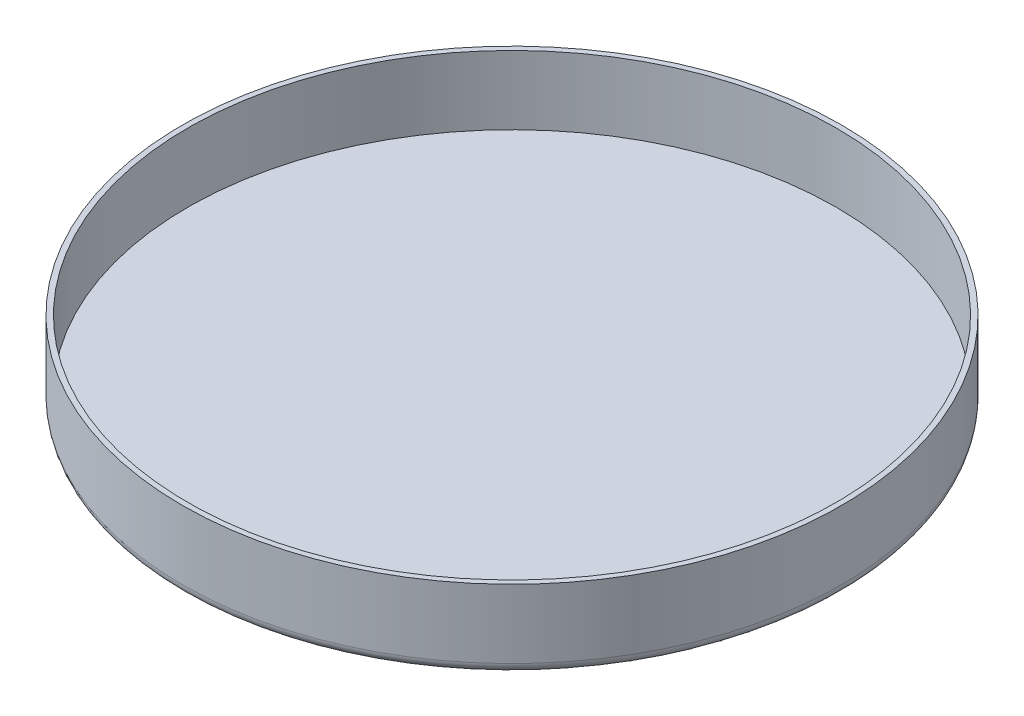
ISO-10303-21;
HEADER;
FILE_DESCRIPTION(('STEP AP214'),'2;1');
FILE_NAME('part.step','',(''),(''),'','','');
FILE_SCHEMA(('AUTOMOTIVE_DESIGN { 1 0 10303 214 1 1 1 1 }'));
ENDSEC;
DATA;
#1=APPLICATION_CONTEXT('core data for automotive mechanical design processes');
#2=APPLICATION_PROTOCOL_DEFINITION('international standard','automotive_design',2000,#1);
#3=PRODUCT_CONTEXT('',#1,'mechanical');
#4=PRODUCT('Part','Part','',(#3));
#5=PRODUCT_RELATED_PRODUCT_CATEGORY('part','',(#4));
#6=PRODUCT_DEFINITION_FORMATION('','',#4);
#7=PRODUCT_DEFINITION_CONTEXT('part definition',#1,'design');
#8=PRODUCT_DEFINITION('design','',#6,#7);
#9=PRODUCT_DEFINITION_SHAPE('','',#8);
#10=(LENGTH_UNIT() NAMED_UNIT(*) SI_UNIT(.MILLI.,.METRE.));
#11=(NAMED_UNIT(*) PLANE_ANGLE_UNIT() SI_UNIT($,.RADIAN.));
#12=(NAMED_UNIT(*) SI_UNIT($,.STERADIAN.) SOLID_ANGLE_UNIT());
#13=UNCERTAINTY_MEASURE_WITH_UNIT(LENGTH_MEASURE(1.E-05),#10,'distance_accuracy_value','');
#14=(GEOMETRIC_REPRESENTATION_CONTEXT(3) GLOBAL_UNCERTAINTY_ASSIGNED_CONTEXT((#13)) GLOBAL_UNIT_ASSIGNED_CONTEXT((#10,
#11,#12)) REPRESENTATION_CONTEXT('',''));
#15=CARTESIAN_POINT('',(0.,0.,0.));
#16=DIRECTION('',(0.,0.,1.));
#17=DIRECTION('',(1.,0.,0.));
#18=AXIS2_PLACEMENT_3D('',#15,#16,#17);
#19=CARTESIAN_POINT('',(0.,19.05,0.));
#20=DIRECTION('',(0.,1.,0.));
#21=DIRECTION('',(0.,0.,1.));
#22=AXIS2_PLACEMENT_3D('',#19,#20,#21);
#23=PLANE('',#22);
#24=CARTESIAN_POINT('',(0.,19.05,0.));
#25=DIRECTION('',(0.,1.,0.));
#26=DIRECTION('',(0.,0.,1.));
#27=AXIS2_PLACEMENT_3D('',#24,#25,#26);
#28=CIRCLE('',#27,79.248);
#29=CARTESIAN_POINT('',(0.,19.05,-79.248));
#30=VERTEX_POINT('',#29);
#31=EDGE_CURVE('E46',#30,#30,#28,.T.);
#32=ORIENTED_EDGE('',*,*,#31,.T.);
#33=EDGE_LOOP('',(#32));
#34=FACE_BOUND('',#33,.T.);
#35=CARTESIAN_POINT('',(0.,19.05,0.));
#36=DIRECTION('',(0.,1.,0.));
#37=DIRECTION('',(0.,0.,1.));
#38=AXIS2_PLACEMENT_3D('',#35,#36,#37);
#39=CIRCLE('',#38,77.978);
#40=CARTESIAN_POINT('',(0.,19.05,-77.978));
#41=VERTEX_POINT('',#40);
#42=EDGE_CURVE('E51',#41,#41,#39,.T.);
#43=ORIENTED_EDGE('',*,*,#42,.F.);
#44=EDGE_LOOP('',(#43));
#45=FACE_BOUND('',#44,.T.);
#46=ADVANCED_FACE('F31',(#34,#45),#23,.T.);
#47=CARTESIAN_POINT('',(0.,0.,0.));
#48=DIRECTION('',(0.,1.,0.));
#49=DIRECTION('',(0.,0.,1.));
#50=AXIS2_PLACEMENT_3D('',#47,#48,#49);
#51=PLANE('',#50);
#52=CARTESIAN_POINT('',(0.,0.,0.));
#53=DIRECTION('',(0.,1.,0.));
#54=DIRECTION('',(0.,0.,1.));
#55=AXIS2_PLACEMENT_3D('',#52,#53,#54);
#56=CIRCLE('',#55,76.708);
#57=CARTESIAN_POINT('',(0.,0.,76.708));
#58=VERTEX_POINT('',#57);
#59=EDGE_CURVE('E10',#58,#58,#56,.F.);
#60=ORIENTED_EDGE('',*,*,#59,.T.);
#61=EDGE_LOOP('',(#60));
#62=FACE_BOUND('',#61,.T.);
#63=ADVANCED_FACE('F58',(#62),#51,.F.);
#64=CARTESIAN_POINT('',(0.,19.05,0.));
#65=DIRECTION('',(0.,-1.,0.));
#66=DIRECTION('',(0.,0.,-1.));
#67=AXIS2_PLACEMENT_3D('',#64,#65,#66);
#68=CYLINDRICAL_SURFACE('',#67,79.248);
#69=CARTESIAN_POINT('',(0.,2.54,0.));
#70=DIRECTION('',(0.,1.,0.));
#71=DIRECTION('',(0.,0.,1.));
#72=AXIS2_PLACEMENT_3D('',#69,#70,#71);
#73=CIRCLE('',#72,79.248);
#74=CARTESIAN_POINT('',(0.,2.54,-79.248));
#75=VERTEX_POINT('',#74);
#76=EDGE_CURVE('E38',#75,#75,#73,.T.);
#77=CARTESIAN_POINT('',(0.,2.54,-79.248));
#78=CARTESIAN_POINT('',(0.,2.71197916666667,-79.248));
#79=CARTESIAN_POINT('',(0.,2.88395833333333,-79.248));
#80=CARTESIAN_POINT('',(0.,3.22791666666667,-79.248));
#81=CARTESIAN_POINT('',(0.,3.39989583333333,-79.248));
#82=CARTESIAN_POINT('',(0.,3.74385416666667,-79.248));
#83=CARTESIAN_POINT('',(0.,3.91583333333333,-79.248));
#84=CARTESIAN_POINT('',(0.,4.25979166666667,-79.248));
#85=CARTESIAN_POINT('',(0.,4.43177083333333,-79.248));
#86=CARTESIAN_POINT('',(0.,4.77572916666667,-79.248));
#87=CARTESIAN_POINT('',(0.,4.94770833333333,-79.248));
#88=CARTESIAN_POINT('',(0.,5.29166666666667,-79.248));
#89=CARTESIAN_POINT('',(0.,5.46364583333333,-79.248));
#90=CARTESIAN_POINT('',(0.,5.80760416666667,-79.248));
#91=CARTESIAN_POINT('',(0.,5.97958333333333,-79.248));
#92=CARTESIAN_POINT('',(0.,6.32354166666667,-79.248));
#93=CARTESIAN_POINT('',(0.,6.49552083333333,-79.248));
#94=CARTESIAN_POINT('',(0.,6.83947916666666,-79.248));
#95=CARTESIAN_POINT('',(0.,7.01145833333333,-79.248));
#96=CARTESIAN_POINT('',(0.,7.35541666666667,-79.248));
#97=CARTESIAN_POINT('',(0.,7.52739583333333,-79.248));
#98=CARTESIAN_POINT('',(0.,7.87135416666667,-79.248));
#99=CARTESIAN_POINT('',(0.,8.04333333333333,-79.248));
#100=CARTESIAN_POINT('',(0.,8.38729166666667,-79.248));
#101=CARTESIAN_POINT('',(0.,8.55927083333333,-79.248));
#102=CARTESIAN_POINT('',(0.,8.90322916666667,-79.248));
#103=CARTESIAN_POINT('',(0.,9.07520833333333,-79.248));
#104=CARTESIAN_POINT('',(0.,9.41916666666667,-79.248));
#105=CARTESIAN_POINT('',(0.,9.59114583333333,-79.248));
#106=CARTESIAN_POINT('',(0.,9.93510416666667,-79.248));
#107=CARTESIAN_POINT('',(0.,10.1070833333333,-79.248));
#108=CARTESIAN_POINT('',(0.,10.4510416666667,-79.248));
#109=CARTESIAN_POINT('',(0.,10.6230208333333,-79.248));
#110=CARTESIAN_POINT('',(0.,10.9669791666667,-79.248));
#111=CARTESIAN_POINT('',(0.,11.1389583333333,-79.248));
#112=CARTESIAN_POINT('',(0.,11.4829166666667,-79.248));
#113=CARTESIAN_POINT('',(0.,11.6548958333333,-79.248));
#114=CARTESIAN_POINT('',(0.,11.9988541666667,-79.248));
#115=CARTESIAN_POINT('',(0.,12.1708333333333,-79.248));
#116=CARTESIAN_POINT('',(0.,12.5147916666667,-79.248));
#117=CARTESIAN_POINT('',(0.,12.6867708333333,-79.248));
#118=CARTESIAN_POINT('',(0.,13.0307291666667,-79.248));
#119=CARTESIAN_POINT('',(0.,13.2027083333333,-79.248));
#120=CARTESIAN_POINT('',(0.,13.5466666666667,-79.248));
#121=CARTESIAN_POINT('',(0.,13.7186458333333,-79.248));
#122=CARTESIAN_POINT('',(0.,14.0626041666667,-79.248));
#123=CARTESIAN_POINT('',(0.,14.2345833333333,-79.248));
#124=CARTESIAN_POINT('',(0.,14.5785416666667,-79.248));
#125=CARTESIAN_POINT('',(0.,14.7505208333333,-79.248));
#126=CARTESIAN_POINT('',(0.,15.0944791666667,-79.248));
#127=CARTESIAN_POINT('',(0.,15.2664583333333,-79.248));
#128=CARTESIAN_POINT('',(0.,15.6104166666667,-79.248));
#129=CARTESIAN_POINT('',(0.,15.7823958333333,-79.248));
#130=CARTESIAN_POINT('',(0.,16.1263541666667,-79.248));
#131=CARTESIAN_POINT('',(0.,16.2983333333333,-79.248));
#132=CARTESIAN_POINT('',(0.,16.6422916666667,-79.248));
#133=CARTESIAN_POINT('',(0.,16.8142708333333,-79.248));
#134=CARTESIAN_POINT('',(0.,17.1582291666667,-79.248));
#135=CARTESIAN_POINT('',(0.,17.3302083333333,-79.248));
#136=CARTESIAN_POINT('',(0.,17.6741666666667,-79.248));
#137=CARTESIAN_POINT('',(0.,17.8461458333333,-79.248));
#138=CARTESIAN_POINT('',(0.,18.1901041666667,-79.248));
#139=CARTESIAN_POINT('',(0.,18.3620833333333,-79.248));
#140=CARTESIAN_POINT('',(0.,18.7060416666667,-79.248));
#141=CARTESIAN_POINT('',(0.,18.8780208333333,-79.248));
#142=CARTESIAN_POINT('',(0.,19.05,-79.248));
#143=B_SPLINE_CURVE_WITH_KNOTS('',3,(#77,#78,#79,#80,#81,#82,#83,#84,#85,#86,#87,#88,#89,#90,
#91,#92,#93,#94,#95,#96,#97,#98,#99,#100,#101,#102,#103,#104,#105,#106,#107,#108,#109,#110,#111,
#112,#113,#114,#115,#116,#117,#118,#119,#120,#121,#122,#123,#124,#125,#126,#127,#128,#129,#130,
#131,#132,#133,#134,#135,#136,#137,#138,#139,#140,#141,#142),.UNSPECIFIED.,.F.,.F.,(4,2,2,2,2,2,
2,2,2,2,2,2,2,2,2,2,2,2,2,2,2,2,2,2,2,2,2,2,2,2,2,2,4),(0.,0.515937500000001,1.031875,1.5478125,
2.06375,2.5796875,3.095625,3.6115625,4.1275,4.6434375,5.159375,5.6753125,6.19125,6.7071875,
7.223125,7.7390625,8.255,8.7709375,9.286875,9.8028125,10.31875,10.8346875,11.350625,11.8665625,
12.3825,12.8984375,13.414375,13.9303125,14.44625,14.9621875,15.478125,15.9940625,16.51),.UNSPECIFIED.);
#144=EDGE_CURVE('BSEAM64',#75,#30,#143,.T.);
#145=ORIENTED_EDGE('',*,*,#76,.T.);
#146=ORIENTED_EDGE('',*,*,#31,.F.);
#147=ORIENTED_EDGE('',*,*,#144,.T.);
#148=ORIENTED_EDGE('',*,*,#144,.F.);
#149=EDGE_LOOP('',(#145,#147,#146,#148));
#150=FACE_BOUND('',#149,.T.);
#151=ADVANCED_FACE('F64',(#150),#68,.T.);
#152=CARTESIAN_POINT('',(0.,19.05,0.));
#153=DIRECTION('',(0.,-1.,0.));
#154=DIRECTION('',(0.,0.,-1.));
#155=AXIS2_PLACEMENT_3D('',#152,#153,#154);
#156=CYLINDRICAL_SURFACE('',#155,77.978);
#157=CARTESIAN_POINT('',(0.,2.54,0.));
#158=DIRECTION('',(0.,1.,0.));
#159=DIRECTION('',(0.,0.,1.));
#160=AXIS2_PLACEMENT_3D('',#157,#158,#159);
#161=CIRCLE('',#160,77.978);
#162=CARTESIAN_POINT('',(0.,2.54,-77.978));
#163=VERTEX_POINT('',#162);
#164=EDGE_CURVE('E42',#163,#163,#161,.T.);
#165=CARTESIAN_POINT('',(0.,2.54,-77.978));
#166=CARTESIAN_POINT('',(0.,2.71197916666667,-77.978));
#167=CARTESIAN_POINT('',(0.,2.88395833333333,-77.978));
#168=CARTESIAN_POINT('',(0.,3.22791666666667,-77.978));
#169=CARTESIAN_POINT('',(0.,3.39989583333333,-77.978));
#170=CARTESIAN_POINT('',(0.,3.74385416666667,-77.978));
#171=CARTESIAN_POINT('',(0.,3.91583333333333,-77.978));
#172=CARTESIAN_POINT('',(0.,4.25979166666667,-77.978));
#173=CARTESIAN_POINT('',(0.,4.43177083333333,-77.978));
#174=CARTESIAN_POINT('',(0.,4.77572916666667,-77.978));
#175=CARTESIAN_POINT('',(0.,4.94770833333333,-77.978));
#176=CARTESIAN_POINT('',(0.,5.29166666666667,-77.978));
#177=CARTESIAN_POINT('',(0.,5.46364583333333,-77.978));
#178=CARTESIAN_POINT('',(0.,5.80760416666667,-77.978));
#179=CARTESIAN_POINT('',(0.,5.97958333333333,-77.978));
#180=CARTESIAN_POINT('',(0.,6.32354166666667,-77.978));
#181=CARTESIAN_POINT('',(0.,6.49552083333333,-77.978));
#182=CARTESIAN_POINT('',(0.,6.83947916666667,-77.978));
#183=CARTESIAN_POINT('',(0.,7.01145833333333,-77.978));
#184=CARTESIAN_POINT('',(0.,7.35541666666667,-77.978));
#185=CARTESIAN_POINT('',(0.,7.52739583333333,-77.978));
#186=CARTESIAN_POINT('',(0.,7.87135416666667,-77.978));
#187=CARTESIAN_POINT('',(0.,8.04333333333333,-77.978));
#188=CARTESIAN_POINT('',(0.,8.38729166666667,-77.978));
#189=CARTESIAN_POINT('',(0.,8.55927083333333,-77.978));
#190=CARTESIAN_POINT('',(0.,8.90322916666667,-77.978));
#191=CARTESIAN_POINT('',(0.,9.07520833333333,-77.978));
#192=CARTESIAN_POINT('',(0.,9.41916666666667,-77.978));
#193=CARTESIAN_POINT('',(0.,9.59114583333333,-77.978));
#194=CARTESIAN_POINT('',(0.,9.93510416666667,-77.978));
#195=CARTESIAN_POINT('',(0.,10.1070833333333,-77.978));
#196=CARTESIAN_POINT('',(0.,10.4510416666667,-77.978));
#197=CARTESIAN_POINT('',(0.,10.6230208333333,-77.978));
#198=CARTESIAN_POINT('',(0.,10.9669791666667,-77.978));
#199=CARTESIAN_POINT('',(0.,11.1389583333333,-77.978));
#200=CARTESIAN_POINT('',(0.,11.4829166666667,-77.978));
#201=CARTESIAN_POINT('',(0.,11.6548958333333,-77.978));
#202=CARTESIAN_POINT('',(0.,11.9988541666667,-77.978));
#203=CARTESIAN_POINT('',(0.,12.1708333333333,-77.978));
#204=CARTESIAN_POINT('',(0.,12.5147916666667,-77.978));
#205=CARTESIAN_POINT('',(0.,12.6867708333333,-77.978));
#206=CARTESIAN_POINT('',(0.,13.0307291666667,-77.978));
#207=CARTESIAN_POINT('',(0.,13.2027083333333,-77.978));
#208=CARTESIAN_POINT('',(0.,13.5466666666667,-77.978));
#209=CARTESIAN_POINT('',(0.,13.7186458333333,-77.978));
#210=CARTESIAN_POINT('',(0.,14.0626041666667,-77.978));
#211=CARTESIAN_POINT('',(0.,14.2345833333333,-77.978));
#212=CARTESIAN_POINT('',(0.,14.5785416666667,-77.978));
#213=CARTESIAN_POINT('',(0.,14.7505208333333,-77.978));
#214=CARTESIAN_POINT('',(0.,15.0944791666667,-77.978));
#215=CARTESIAN_POINT('',(0.,15.2664583333333,-77.978));
#216=CARTESIAN_POINT('',(0.,15.6104166666667,-77.978));
#217=CARTESIAN_POINT('',(0.,15.7823958333333,-77.978));
#218=CARTESIAN_POINT('',(0.,16.1263541666667,-77.978));
#219=CARTESIAN_POINT('',(0.,16.2983333333333,-77.978));
#220=CARTESIAN_POINT('',(0.,16.6422916666667,-77.978));
#221=CARTESIAN_POINT('',(0.,16.8142708333333,-77.978));
#222=CARTESIAN_POINT('',(0.,17.1582291666667,-77.978));
#223=CARTESIAN_POINT('',(0.,17.3302083333333,-77.978));
#224=CARTESIAN_POINT('',(0.,17.6741666666667,-77.978));
#225=CARTESIAN_POINT('',(0.,17.8461458333333,-77.978));
#226=CARTESIAN_POINT('',(0.,18.1901041666667,-77.978));
#227=CARTESIAN_POINT('',(0.,18.3620833333333,-77.978));
#228=CARTESIAN_POINT('',(0.,18.7060416666667,-77.978));
#229=CARTESIAN_POINT('',(0.,18.8780208333333,-77.978));
#230=CARTESIAN_POINT('',(0.,19.05,-77.978));
#231=B_SPLINE_CURVE_WITH_KNOTS('',3,(#165,#166,#167,#168,#169,#170,#171,#172,#173,#174,#175,
#176,#177,#178,#179,#180,#181,#182,#183,#184,#185,#186,#187,#188,#189,#190,#191,#192,#193,#194,
#195,#196,#197,#198,#199,#200,#201,#202,#203,#204,#205,#206,#207,#208,#209,#210,#211,#212,#213,
#214,#215,#216,#217,#218,#219,#220,#221,#222,#223,#224,#225,#226,#227,#228,#229,#230),
.UNSPECIFIED.,.F.,.F.,(4,2,2,2,2,2,2,2,2,2,2,2,2,2,2,2,2,2,2,2,2,2,2,2,2,2,2,2,2,2,2,2,4),(0.,
0.515937500000001,1.031875,1.5478125,2.06375,2.5796875,3.095625,3.6115625,4.1275,4.6434375,
5.159375,5.6753125,6.19125,6.7071875,7.223125,7.7390625,8.255,8.7709375,9.286875,9.8028125,
10.31875,10.8346875,11.350625,11.8665625,12.3825,12.8984375,13.414375,13.9303125,14.44625,
14.9621875,15.478125,15.9940625,16.51),.UNSPECIFIED.);
#232=EDGE_CURVE('BSEAM55',#163,#41,#231,.T.);
#233=ORIENTED_EDGE('',*,*,#164,.F.);
#234=ORIENTED_EDGE('',*,*,#42,.T.);
#235=ORIENTED_EDGE('',*,*,#232,.T.);
#236=ORIENTED_EDGE('',*,*,#232,.F.);
#237=EDGE_LOOP('',(#233,#235,#234,#236));
#238=FACE_BOUND('',#237,.T.);
#239=ADVANCED_FACE('F55',(#238),#156,.F.);
#240=CARTESIAN_POINT('',(0.,2.54,0.));
#241=DIRECTION('',(0.,1.,0.));
#242=DIRECTION('',(0.,0.,1.));
#243=AXIS2_PLACEMENT_3D('',#240,#241,#242);
#244=PLANE('',#243);
#245=ORIENTED_EDGE('',*,*,#164,.T.);
#246=EDGE_LOOP('',(#245));
#247=FACE_BOUND('',#246,.T.);
#248=ADVANCED_FACE('F72',(#247),#244,.T.);
#249=CARTESIAN_POINT('',(0.,2.54,0.));
#250=DIRECTION('',(0.,1.,0.));
#251=DIRECTION('',(0.,0.,1.));
#252=AXIS2_PLACEMENT_3D('',#249,#250,#251);
#253=TOROIDAL_SURFACE('',#252,76.708,2.54);
#254=ORIENTED_EDGE('',*,*,#59,.F.);
#255=EDGE_LOOP('',(#254));
#256=FACE_BOUND('',#255,.T.);
#257=ORIENTED_EDGE('',*,*,#76,.F.);
#258=EDGE_LOOP('',(#257));
#259=FACE_BOUND('',#258,.T.);
#260=ADVANCED_FACE('F33',(#256,#259),#253,.T.);
#261=CLOSED_SHELL('',(#46,#63,#151,#239,#248,#260));
#262=MANIFOLD_SOLID_BREP('B2',#261);
#263=ADVANCED_BREP_SHAPE_REPRESENTATION('',(#18,#262),#14);
#264=SHAPE_DEFINITION_REPRESENTATION(#9,#263);
ENDSEC;
END-ISO-10303-21;
